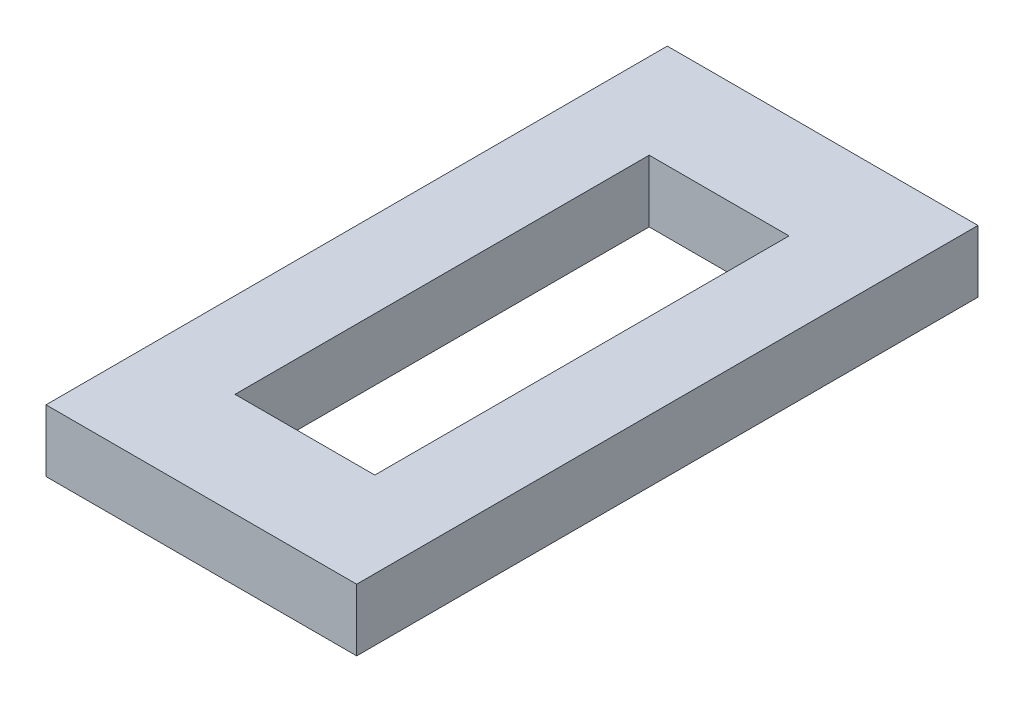
ISO-10303-21;
HEADER;
FILE_DESCRIPTION(('STEP AP214'),'2;1');
FILE_NAME('part.step','',(''),(''),'','','');
FILE_SCHEMA(('AUTOMOTIVE_DESIGN { 1 0 10303 214 1 1 1 1 }'));
ENDSEC;
DATA;
#1=APPLICATION_CONTEXT('core data for automotive mechanical design processes');
#2=APPLICATION_PROTOCOL_DEFINITION('international standard','automotive_design',2000,#1);
#3=PRODUCT_CONTEXT('',#1,'mechanical');
#4=PRODUCT('Part','Part','',(#3));
#5=PRODUCT_RELATED_PRODUCT_CATEGORY('part','',(#4));
#6=PRODUCT_DEFINITION_FORMATION('','',#4);
#7=PRODUCT_DEFINITION_CONTEXT('part definition',#1,'design');
#8=PRODUCT_DEFINITION('design','',#6,#7);
#9=PRODUCT_DEFINITION_SHAPE('','',#8);
#10=(LENGTH_UNIT() NAMED_UNIT(*) SI_UNIT(.MILLI.,.METRE.));
#11=(NAMED_UNIT(*) PLANE_ANGLE_UNIT() SI_UNIT($,.RADIAN.));
#12=(NAMED_UNIT(*) SI_UNIT($,.STERADIAN.) SOLID_ANGLE_UNIT());
#13=UNCERTAINTY_MEASURE_WITH_UNIT(LENGTH_MEASURE(1.E-05),#10,'distance_accuracy_value','');
#14=(GEOMETRIC_REPRESENTATION_CONTEXT(3) GLOBAL_UNCERTAINTY_ASSIGNED_CONTEXT((#13)) GLOBAL_UNIT_ASSIGNED_CONTEXT((#10,
#11,#12)) REPRESENTATION_CONTEXT('',''));
#15=CARTESIAN_POINT('',(0.,0.,0.));
#16=DIRECTION('',(0.,0.,1.));
#17=DIRECTION('',(1.,0.,0.));
#18=AXIS2_PLACEMENT_3D('',#15,#16,#17);
#19=CARTESIAN_POINT('',(0.,6.,0.));
#20=DIRECTION('',(0.,1.,0.));
#21=DIRECTION('',(0.,0.,1.));
#22=AXIS2_PLACEMENT_3D('',#19,#20,#21);
#23=PLANE('',#22);
#24=DIRECTION('',(0.,0.,-1.));
#25=VECTOR('',#24,1.);
#26=CARTESIAN_POINT('',(15.,6.,-30.));
#27=LINE('',#26,#25);
#28=CARTESIAN_POINT('',(15.,6.,30.));
#29=VERTEX_POINT('',#28);
#30=CARTESIAN_POINT('',(15.,6.,-30.));
#31=VERTEX_POINT('',#30);
#32=EDGE_CURVE('E153',#29,#31,#27,.T.);
#33=ORIENTED_EDGE('',*,*,#32,.T.);
#34=DIRECTION('',(-1.,0.,0.));
#35=VECTOR('',#34,1.);
#36=CARTESIAN_POINT('',(-15.,6.,-30.));
#37=LINE('',#36,#35);
#38=CARTESIAN_POINT('',(-15.,6.,-30.));
#39=VERTEX_POINT('',#38);
#40=EDGE_CURVE('E157',#31,#39,#37,.T.);
#41=ORIENTED_EDGE('',*,*,#40,.T.);
#42=DIRECTION('',(0.,0.,1.));
#43=VECTOR('',#42,1.);
#44=CARTESIAN_POINT('',(-15.,6.,-30.));
#45=LINE('',#44,#43);
#46=CARTESIAN_POINT('',(-15.,6.,30.));
#47=VERTEX_POINT('',#46);
#48=EDGE_CURVE('E161',#39,#47,#45,.T.);
#49=ORIENTED_EDGE('',*,*,#48,.T.);
#50=DIRECTION('',(1.,0.,0.));
#51=VECTOR('',#50,1.);
#52=CARTESIAN_POINT('',(-15.,6.,30.));
#53=LINE('',#52,#51);
#54=EDGE_CURVE('E164',#47,#29,#53,.T.);
#55=ORIENTED_EDGE('',*,*,#54,.T.);
#56=EDGE_LOOP('',(#33,#41,#49,#55));
#57=FACE_BOUND('',#56,.T.);
#58=DIRECTION('',(-1.,0.,0.));
#59=VECTOR('',#58,1.);
#60=CARTESIAN_POINT('',(-6.74999999999999,6.,-20.));
#61=LINE('',#60,#59);
#62=CARTESIAN_POINT('',(6.75000000000001,6.,-20.));
#63=VERTEX_POINT('',#62);
#64=CARTESIAN_POINT('',(-6.74999999999999,6.,-20.));
#65=VERTEX_POINT('',#64);
#66=EDGE_CURVE('E114',#63,#65,#61,.T.);
#67=ORIENTED_EDGE('',*,*,#66,.F.);
#68=DIRECTION('',(0.,0.,-1.));
#69=VECTOR('',#68,1.);
#70=CARTESIAN_POINT('',(6.75000000000001,6.,-20.));
#71=LINE('',#70,#69);
#72=CARTESIAN_POINT('',(6.75000000000001,6.,20.));
#73=VERTEX_POINT('',#72);
#74=EDGE_CURVE('E105',#73,#63,#71,.T.);
#75=ORIENTED_EDGE('',*,*,#74,.F.);
#76=DIRECTION('',(1.,0.,0.));
#77=VECTOR('',#76,1.);
#78=CARTESIAN_POINT('',(-6.74999999999999,6.,20.));
#79=LINE('',#78,#77);
#80=CARTESIAN_POINT('',(-6.74999999999999,6.,20.));
#81=VERTEX_POINT('',#80);
#82=EDGE_CURVE('E131',#81,#73,#79,.T.);
#83=ORIENTED_EDGE('',*,*,#82,.F.);
#84=DIRECTION('',(0.,0.,1.));
#85=VECTOR('',#84,1.);
#86=CARTESIAN_POINT('',(-6.74999999999999,6.,-20.));
#87=LINE('',#86,#85);
#88=EDGE_CURVE('E127',#65,#81,#87,.T.);
#89=ORIENTED_EDGE('',*,*,#88,.F.);
#90=EDGE_LOOP('',(#67,#75,#83,#89));
#91=FACE_BOUND('',#90,.T.);
#92=ADVANCED_FACE('F39',(#57,#91),#23,.T.);
#93=CARTESIAN_POINT('',(0.,0.,0.));
#94=DIRECTION('',(0.,1.,0.));
#95=DIRECTION('',(0.,0.,1.));
#96=AXIS2_PLACEMENT_3D('',#93,#94,#95);
#97=PLANE('',#96);
#98=DIRECTION('',(0.,0.,-1.));
#99=VECTOR('',#98,1.);
#100=CARTESIAN_POINT('',(15.,0.,-30.));
#101=LINE('',#100,#99);
#102=CARTESIAN_POINT('',(15.,0.,30.));
#103=VERTEX_POINT('',#102);
#104=CARTESIAN_POINT('',(15.,0.,-30.));
#105=VERTEX_POINT('',#104);
#106=EDGE_CURVE('E123',#103,#105,#101,.T.);
#107=ORIENTED_EDGE('',*,*,#106,.F.);
#108=DIRECTION('',(1.,0.,0.));
#109=VECTOR('',#108,1.);
#110=CARTESIAN_POINT('',(-15.,0.,30.));
#111=LINE('',#110,#109);
#112=CARTESIAN_POINT('',(-15.,0.,30.));
#113=VERTEX_POINT('',#112);
#114=EDGE_CURVE('E158',#113,#103,#111,.T.);
#115=ORIENTED_EDGE('',*,*,#114,.F.);
#116=DIRECTION('',(0.,0.,1.));
#117=VECTOR('',#116,1.);
#118=CARTESIAN_POINT('',(-15.,0.,-30.));
#119=LINE('',#118,#117);
#120=CARTESIAN_POINT('',(-15.,0.,-30.));
#121=VERTEX_POINT('',#120);
#122=EDGE_CURVE('E174',#121,#113,#119,.T.);
#123=ORIENTED_EDGE('',*,*,#122,.F.);
#124=DIRECTION('',(-1.,0.,0.));
#125=VECTOR('',#124,1.);
#126=CARTESIAN_POINT('',(-15.,0.,-30.));
#127=LINE('',#126,#125);
#128=EDGE_CURVE('E171',#105,#121,#127,.T.);
#129=ORIENTED_EDGE('',*,*,#128,.F.);
#130=EDGE_LOOP('',(#107,#115,#123,#129));
#131=FACE_BOUND('',#130,.T.);
#132=DIRECTION('',(0.,0.,-1.));
#133=VECTOR('',#132,1.);
#134=CARTESIAN_POINT('',(6.75000000000001,0.,-20.));
#135=LINE('',#134,#133);
#136=CARTESIAN_POINT('',(6.75000000000001,0.,20.));
#137=VERTEX_POINT('',#136);
#138=CARTESIAN_POINT('',(6.75000000000001,0.,-20.));
#139=VERTEX_POINT('',#138);
#140=EDGE_CURVE('E63',#137,#139,#135,.T.);
#141=ORIENTED_EDGE('',*,*,#140,.T.);
#142=DIRECTION('',(-1.,0.,0.));
#143=VECTOR('',#142,1.);
#144=CARTESIAN_POINT('',(-6.74999999999999,0.,-20.));
#145=LINE('',#144,#143);
#146=CARTESIAN_POINT('',(-6.74999999999999,0.,-20.));
#147=VERTEX_POINT('',#146);
#148=EDGE_CURVE('E121',#139,#147,#145,.T.);
#149=ORIENTED_EDGE('',*,*,#148,.T.);
#150=DIRECTION('',(0.,0.,1.));
#151=VECTOR('',#150,1.);
#152=CARTESIAN_POINT('',(-6.74999999999999,0.,-20.));
#153=LINE('',#152,#151);
#154=CARTESIAN_POINT('',(-6.74999999999999,0.,20.));
#155=VERTEX_POINT('',#154);
#156=EDGE_CURVE('E140',#147,#155,#153,.T.);
#157=ORIENTED_EDGE('',*,*,#156,.T.);
#158=DIRECTION('',(1.,0.,0.));
#159=VECTOR('',#158,1.);
#160=CARTESIAN_POINT('',(-6.74999999999999,0.,20.));
#161=LINE('',#160,#159);
#162=EDGE_CURVE('E115',#155,#137,#161,.T.);
#163=ORIENTED_EDGE('',*,*,#162,.T.);
#164=EDGE_LOOP('',(#141,#149,#157,#163));
#165=FACE_BOUND('',#164,.T.);
#166=ADVANCED_FACE('F197',(#131,#165),#97,.F.);
#167=CARTESIAN_POINT('',(15.,6.,-30.));
#168=DIRECTION('',(-1.,0.,0.));
#169=DIRECTION('',(0.,0.,1.));
#170=AXIS2_PLACEMENT_3D('',#167,#168,#169);
#171=PLANE('',#170);
#172=ORIENTED_EDGE('',*,*,#106,.T.);
#173=DIRECTION('',(0.,-1.,0.));
#174=VECTOR('',#173,1.);
#175=CARTESIAN_POINT('',(15.,6.,-30.));
#176=LINE('',#175,#174);
#177=EDGE_CURVE('E11',#31,#105,#176,.T.);
#178=ORIENTED_EDGE('',*,*,#177,.F.);
#179=ORIENTED_EDGE('',*,*,#32,.F.);
#180=DIRECTION('',(0.,-1.,0.));
#181=VECTOR('',#180,1.);
#182=CARTESIAN_POINT('',(15.,6.,30.));
#183=LINE('',#182,#181);
#184=EDGE_CURVE('E167',#29,#103,#183,.T.);
#185=ORIENTED_EDGE('',*,*,#184,.T.);
#186=EDGE_LOOP('',(#172,#178,#179,#185));
#187=FACE_BOUND('',#186,.T.);
#188=ADVANCED_FACE('F41',(#187),#171,.F.);
#189=CARTESIAN_POINT('',(-15.,6.,-30.));
#190=DIRECTION('',(0.,0.,1.));
#191=DIRECTION('',(1.,0.,0.));
#192=AXIS2_PLACEMENT_3D('',#189,#190,#191);
#193=PLANE('',#192);
#194=ORIENTED_EDGE('',*,*,#128,.T.);
#195=DIRECTION('',(0.,-1.,0.));
#196=VECTOR('',#195,1.);
#197=CARTESIAN_POINT('',(-15.,6.,-30.));
#198=LINE('',#197,#196);
#199=EDGE_CURVE('E48',#39,#121,#198,.T.);
#200=ORIENTED_EDGE('',*,*,#199,.F.);
#201=ORIENTED_EDGE('',*,*,#40,.F.);
#202=ORIENTED_EDGE('',*,*,#177,.T.);
#203=EDGE_LOOP('',(#194,#200,#201,#202));
#204=FACE_BOUND('',#203,.T.);
#205=ADVANCED_FACE('F207',(#204),#193,.F.);
#206=CARTESIAN_POINT('',(-15.,6.,-30.));
#207=DIRECTION('',(1.,0.,0.));
#208=DIRECTION('',(0.,0.,-1.));
#209=AXIS2_PLACEMENT_3D('',#206,#207,#208);
#210=PLANE('',#209);
#211=ORIENTED_EDGE('',*,*,#122,.T.);
#212=DIRECTION('',(0.,-1.,0.));
#213=VECTOR('',#212,1.);
#214=CARTESIAN_POINT('',(-15.,6.,30.));
#215=LINE('',#214,#213);
#216=EDGE_CURVE('E182',#47,#113,#215,.T.);
#217=ORIENTED_EDGE('',*,*,#216,.F.);
#218=ORIENTED_EDGE('',*,*,#48,.F.);
#219=ORIENTED_EDGE('',*,*,#199,.T.);
#220=EDGE_LOOP('',(#211,#217,#218,#219));
#221=FACE_BOUND('',#220,.T.);
#222=ADVANCED_FACE('F191',(#221),#210,.F.);
#223=CARTESIAN_POINT('',(-15.,6.,30.));
#224=DIRECTION('',(0.,0.,-1.));
#225=DIRECTION('',(-1.,0.,0.));
#226=AXIS2_PLACEMENT_3D('',#223,#224,#225);
#227=PLANE('',#226);
#228=ORIENTED_EDGE('',*,*,#114,.T.);
#229=ORIENTED_EDGE('',*,*,#184,.F.);
#230=ORIENTED_EDGE('',*,*,#54,.F.);
#231=ORIENTED_EDGE('',*,*,#216,.T.);
#232=EDGE_LOOP('',(#228,#229,#230,#231));
#233=FACE_BOUND('',#232,.T.);
#234=ADVANCED_FACE('F201',(#233),#227,.F.);
#235=CARTESIAN_POINT('',(6.75000000000001,6.,-20.));
#236=DIRECTION('',(-1.,0.,0.));
#237=DIRECTION('',(0.,0.,1.));
#238=AXIS2_PLACEMENT_3D('',#235,#236,#237);
#239=PLANE('',#238);
#240=ORIENTED_EDGE('',*,*,#140,.F.);
#241=DIRECTION('',(0.,-1.,0.));
#242=VECTOR('',#241,1.);
#243=CARTESIAN_POINT('',(6.75000000000001,6.,20.));
#244=LINE('',#243,#242);
#245=EDGE_CURVE('E109',#73,#137,#244,.T.);
#246=ORIENTED_EDGE('',*,*,#245,.F.);
#247=ORIENTED_EDGE('',*,*,#74,.T.);
#248=DIRECTION('',(0.,-1.,0.));
#249=VECTOR('',#248,1.);
#250=CARTESIAN_POINT('',(6.75000000000001,6.,-20.));
#251=LINE('',#250,#249);
#252=EDGE_CURVE('E108',#63,#139,#251,.T.);
#253=ORIENTED_EDGE('',*,*,#252,.T.);
#254=EDGE_LOOP('',(#240,#246,#247,#253));
#255=FACE_BOUND('',#254,.T.);
#256=ADVANCED_FACE('F107',(#255),#239,.T.);
#257=CARTESIAN_POINT('',(-6.74999999999999,6.,-20.));
#258=DIRECTION('',(0.,0.,1.));
#259=DIRECTION('',(1.,0.,0.));
#260=AXIS2_PLACEMENT_3D('',#257,#258,#259);
#261=PLANE('',#260);
#262=ORIENTED_EDGE('',*,*,#148,.F.);
#263=ORIENTED_EDGE('',*,*,#252,.F.);
#264=ORIENTED_EDGE('',*,*,#66,.T.);
#265=DIRECTION('',(0.,-1.,0.));
#266=VECTOR('',#265,1.);
#267=CARTESIAN_POINT('',(-6.74999999999999,6.,-20.));
#268=LINE('',#267,#266);
#269=EDGE_CURVE('E124',#65,#147,#268,.T.);
#270=ORIENTED_EDGE('',*,*,#269,.T.);
#271=EDGE_LOOP('',(#262,#263,#264,#270));
#272=FACE_BOUND('',#271,.T.);
#273=ADVANCED_FACE('F118',(#272),#261,.T.);
#274=CARTESIAN_POINT('',(-6.74999999999999,6.,-20.));
#275=DIRECTION('',(1.,0.,0.));
#276=DIRECTION('',(0.,0.,-1.));
#277=AXIS2_PLACEMENT_3D('',#274,#275,#276);
#278=PLANE('',#277);
#279=ORIENTED_EDGE('',*,*,#156,.F.);
#280=ORIENTED_EDGE('',*,*,#269,.F.);
#281=ORIENTED_EDGE('',*,*,#88,.T.);
#282=DIRECTION('',(0.,-1.,0.));
#283=VECTOR('',#282,1.);
#284=CARTESIAN_POINT('',(-6.74999999999999,6.,20.));
#285=LINE('',#284,#283);
#286=EDGE_CURVE('E55',#81,#155,#285,.T.);
#287=ORIENTED_EDGE('',*,*,#286,.T.);
#288=EDGE_LOOP('',(#279,#280,#281,#287));
#289=FACE_BOUND('',#288,.T.);
#290=ADVANCED_FACE('F230',(#289),#278,.T.);
#291=CARTESIAN_POINT('',(-6.74999999999999,6.,20.));
#292=DIRECTION('',(0.,0.,-1.));
#293=DIRECTION('',(-1.,0.,0.));
#294=AXIS2_PLACEMENT_3D('',#291,#292,#293);
#295=PLANE('',#294);
#296=ORIENTED_EDGE('',*,*,#162,.F.);
#297=ORIENTED_EDGE('',*,*,#286,.F.);
#298=ORIENTED_EDGE('',*,*,#82,.T.);
#299=ORIENTED_EDGE('',*,*,#245,.T.);
#300=EDGE_LOOP('',(#296,#297,#298,#299));
#301=FACE_BOUND('',#300,.T.);
#302=ADVANCED_FACE('F234',(#301),#295,.T.);
#303=CLOSED_SHELL('',(#92,#166,#188,#205,#222,#234,#256,#273,#290,#302));
#304=MANIFOLD_SOLID_BREP('B2',#303);
#305=ADVANCED_BREP_SHAPE_REPRESENTATION('',(#18,#304),#14);
#306=SHAPE_DEFINITION_REPRESENTATION(#9,#305);
ENDSEC;
END-ISO-10303-21;
